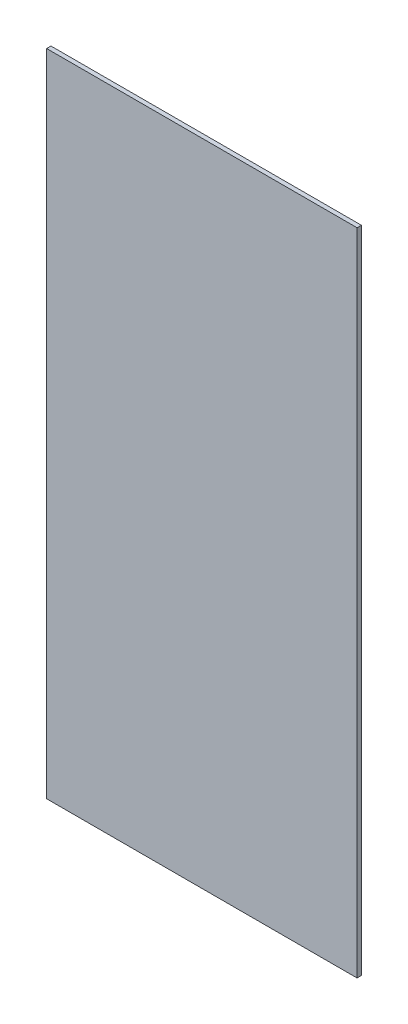
ISO-10303-21;
HEADER;
FILE_DESCRIPTION(('STEP AP214'),'2;1');
FILE_NAME('part.step','',(''),(''),'','','');
FILE_SCHEMA(('AUTOMOTIVE_DESIGN { 1 0 10303 214 1 1 1 1 }'));
ENDSEC;
DATA;
#1=APPLICATION_CONTEXT('core data for automotive mechanical design processes');
#2=APPLICATION_PROTOCOL_DEFINITION('international standard','automotive_design',2000,#1);
#3=PRODUCT_CONTEXT('',#1,'mechanical');
#4=PRODUCT('Part','Part','',(#3));
#5=PRODUCT_RELATED_PRODUCT_CATEGORY('part','',(#4));
#6=PRODUCT_DEFINITION_FORMATION('','',#4);
#7=PRODUCT_DEFINITION_CONTEXT('part definition',#1,'design');
#8=PRODUCT_DEFINITION('design','',#6,#7);
#9=PRODUCT_DEFINITION_SHAPE('','',#8);
#10=(LENGTH_UNIT() NAMED_UNIT(*) SI_UNIT(.MILLI.,.METRE.));
#11=(NAMED_UNIT(*) PLANE_ANGLE_UNIT() SI_UNIT($,.RADIAN.));
#12=(NAMED_UNIT(*) SI_UNIT($,.STERADIAN.) SOLID_ANGLE_UNIT());
#13=UNCERTAINTY_MEASURE_WITH_UNIT(LENGTH_MEASURE(1.E-05),#10,'distance_accuracy_value','');
#14=(GEOMETRIC_REPRESENTATION_CONTEXT(3) GLOBAL_UNCERTAINTY_ASSIGNED_CONTEXT((#13)) GLOBAL_UNIT_ASSIGNED_CONTEXT((#10,
#11,#12)) REPRESENTATION_CONTEXT('',''));
#15=CARTESIAN_POINT('',(0.,0.,0.));
#16=DIRECTION('',(0.,0.,1.));
#17=DIRECTION('',(1.,0.,0.));
#18=AXIS2_PLACEMENT_3D('',#15,#16,#17);
#19=CARTESIAN_POINT('',(107.5,-225.,3.));
#20=DIRECTION('',(-1.,0.,0.));
#21=DIRECTION('',(0.,0.,1.));
#22=AXIS2_PLACEMENT_3D('',#19,#20,#21);
#23=PLANE('',#22);
#24=DIRECTION('',(0.,1.,0.));
#25=VECTOR('',#24,1.);
#26=CARTESIAN_POINT('',(107.5,-225.,0.));
#27=LINE('',#26,#25);
#28=CARTESIAN_POINT('',(107.5,-225.,0.));
#29=VERTEX_POINT('',#28);
#30=CARTESIAN_POINT('',(107.5,225.,0.));
#31=VERTEX_POINT('',#30);
#32=EDGE_CURVE('E107',#29,#31,#27,.T.);
#33=ORIENTED_EDGE('',*,*,#32,.T.);
#34=DIRECTION('',(0.,0.,-1.));
#35=VECTOR('',#34,1.);
#36=CARTESIAN_POINT('',(107.5,225.,3.));
#37=LINE('',#36,#35);
#38=CARTESIAN_POINT('',(107.5,225.,3.));
#39=VERTEX_POINT('',#38);
#40=EDGE_CURVE('E11',#39,#31,#37,.T.);
#41=ORIENTED_EDGE('',*,*,#40,.F.);
#42=DIRECTION('',(0.,1.,0.));
#43=VECTOR('',#42,1.);
#44=CARTESIAN_POINT('',(107.5,-225.,3.));
#45=LINE('',#44,#43);
#46=CARTESIAN_POINT('',(107.5,-225.,3.));
#47=VERTEX_POINT('',#46);
#48=EDGE_CURVE('E91',#47,#39,#45,.T.);
#49=ORIENTED_EDGE('',*,*,#48,.F.);
#50=DIRECTION('',(0.,0.,-1.));
#51=VECTOR('',#50,1.);
#52=CARTESIAN_POINT('',(107.5,-225.,3.));
#53=LINE('',#52,#51);
#54=EDGE_CURVE('E103',#47,#29,#53,.T.);
#55=ORIENTED_EDGE('',*,*,#54,.T.);
#56=EDGE_LOOP('',(#33,#41,#49,#55));
#57=FACE_BOUND('',#56,.T.);
#58=ADVANCED_FACE('F39',(#57),#23,.F.);
#59=CARTESIAN_POINT('',(-107.5,225.,3.));
#60=DIRECTION('',(0.,-1.,0.));
#61=DIRECTION('',(0.,0.,-1.));
#62=AXIS2_PLACEMENT_3D('',#59,#60,#61);
#63=PLANE('',#62);
#64=DIRECTION('',(-1.,0.,0.));
#65=VECTOR('',#64,1.);
#66=CARTESIAN_POINT('',(-107.5,225.,0.));
#67=LINE('',#66,#65);
#68=CARTESIAN_POINT('',(-107.5,225.,0.));
#69=VERTEX_POINT('',#68);
#70=EDGE_CURVE('E96',#31,#69,#67,.T.);
#71=ORIENTED_EDGE('',*,*,#70,.T.);
#72=DIRECTION('',(0.,0.,-1.));
#73=VECTOR('',#72,1.);
#74=CARTESIAN_POINT('',(-107.5,225.,3.));
#75=LINE('',#74,#73);
#76=CARTESIAN_POINT('',(-107.5,225.,3.));
#77=VERTEX_POINT('',#76);
#78=EDGE_CURVE('E48',#77,#69,#75,.T.);
#79=ORIENTED_EDGE('',*,*,#78,.F.);
#80=DIRECTION('',(-1.,0.,0.));
#81=VECTOR('',#80,1.);
#82=CARTESIAN_POINT('',(-107.5,225.,3.));
#83=LINE('',#82,#81);
#84=EDGE_CURVE('E86',#39,#77,#83,.T.);
#85=ORIENTED_EDGE('',*,*,#84,.F.);
#86=ORIENTED_EDGE('',*,*,#40,.T.);
#87=EDGE_LOOP('',(#71,#79,#85,#86));
#88=FACE_BOUND('',#87,.T.);
#89=ADVANCED_FACE('F95',(#88),#63,.F.);
#90=CARTESIAN_POINT('',(-107.5,-225.,3.));
#91=DIRECTION('',(1.,0.,0.));
#92=DIRECTION('',(0.,0.,-1.));
#93=AXIS2_PLACEMENT_3D('',#90,#91,#92);
#94=PLANE('',#93);
#95=DIRECTION('',(0.,-1.,0.));
#96=VECTOR('',#95,1.);
#97=CARTESIAN_POINT('',(-107.5,-225.,0.));
#98=LINE('',#97,#96);
#99=CARTESIAN_POINT('',(-107.5,-225.,0.));
#100=VERTEX_POINT('',#99);
#101=EDGE_CURVE('E73',#69,#100,#98,.T.);
#102=ORIENTED_EDGE('',*,*,#101,.T.);
#103=DIRECTION('',(0.,0.,-1.));
#104=VECTOR('',#103,1.);
#105=CARTESIAN_POINT('',(-107.5,-225.,3.));
#106=LINE('',#105,#104);
#107=CARTESIAN_POINT('',(-107.5,-225.,3.));
#108=VERTEX_POINT('',#107);
#109=EDGE_CURVE('E98',#108,#100,#106,.T.);
#110=ORIENTED_EDGE('',*,*,#109,.F.);
#111=DIRECTION('',(0.,-1.,0.));
#112=VECTOR('',#111,1.);
#113=CARTESIAN_POINT('',(-107.5,-225.,3.));
#114=LINE('',#113,#112);
#115=EDGE_CURVE('E89',#77,#108,#114,.T.);
#116=ORIENTED_EDGE('',*,*,#115,.F.);
#117=ORIENTED_EDGE('',*,*,#78,.T.);
#118=EDGE_LOOP('',(#102,#110,#116,#117));
#119=FACE_BOUND('',#118,.T.);
#120=ADVANCED_FACE('F99',(#119),#94,.F.);
#121=CARTESIAN_POINT('',(-107.5,-225.,3.));
#122=DIRECTION('',(0.,1.,0.));
#123=DIRECTION('',(0.,0.,1.));
#124=AXIS2_PLACEMENT_3D('',#121,#122,#123);
#125=PLANE('',#124);
#126=DIRECTION('',(1.,0.,0.));
#127=VECTOR('',#126,1.);
#128=CARTESIAN_POINT('',(-107.5,-225.,0.));
#129=LINE('',#128,#127);
#130=EDGE_CURVE('E79',#100,#29,#129,.T.);
#131=ORIENTED_EDGE('',*,*,#130,.T.);
#132=ORIENTED_EDGE('',*,*,#54,.F.);
#133=DIRECTION('',(1.,0.,0.));
#134=VECTOR('',#133,1.);
#135=CARTESIAN_POINT('',(-107.5,-225.,3.));
#136=LINE('',#135,#134);
#137=EDGE_CURVE('E56',#108,#47,#136,.T.);
#138=ORIENTED_EDGE('',*,*,#137,.F.);
#139=ORIENTED_EDGE('',*,*,#109,.T.);
#140=EDGE_LOOP('',(#131,#132,#138,#139));
#141=FACE_BOUND('',#140,.T.);
#142=ADVANCED_FACE('F120',(#141),#125,.F.);
#143=CARTESIAN_POINT('',(0.,0.,3.));
#144=DIRECTION('',(0.,0.,-1.));
#145=DIRECTION('',(-1.,0.,0.));
#146=AXIS2_PLACEMENT_3D('',#143,#144,#145);
#147=PLANE('',#146);
#148=ORIENTED_EDGE('',*,*,#48,.T.);
#149=ORIENTED_EDGE('',*,*,#84,.T.);
#150=ORIENTED_EDGE('',*,*,#115,.T.);
#151=ORIENTED_EDGE('',*,*,#137,.T.);
#152=EDGE_LOOP('',(#148,#149,#150,#151));
#153=FACE_BOUND('',#152,.T.);
#154=ADVANCED_FACE('F87',(#153),#147,.F.);
#155=CARTESIAN_POINT('',(0.,0.,0.));
#156=DIRECTION('',(0.,0.,-1.));
#157=DIRECTION('',(-1.,0.,0.));
#158=AXIS2_PLACEMENT_3D('',#155,#156,#157);
#159=PLANE('',#158);
#160=ORIENTED_EDGE('',*,*,#32,.F.);
#161=ORIENTED_EDGE('',*,*,#130,.F.);
#162=ORIENTED_EDGE('',*,*,#101,.F.);
#163=ORIENTED_EDGE('',*,*,#70,.F.);
#164=EDGE_LOOP('',(#160,#161,#162,#163));
#165=FACE_BOUND('',#164,.T.);
#166=ADVANCED_FACE('F123',(#165),#159,.T.);
#167=CLOSED_SHELL('',(#58,#89,#120,#142,#154,#166));
#168=MANIFOLD_SOLID_BREP('B2',#167);
#169=ADVANCED_BREP_SHAPE_REPRESENTATION('',(#18,#168),#14);
#170=SHAPE_DEFINITION_REPRESENTATION(#9,#169);
ENDSEC;
END-ISO-10303-21;
